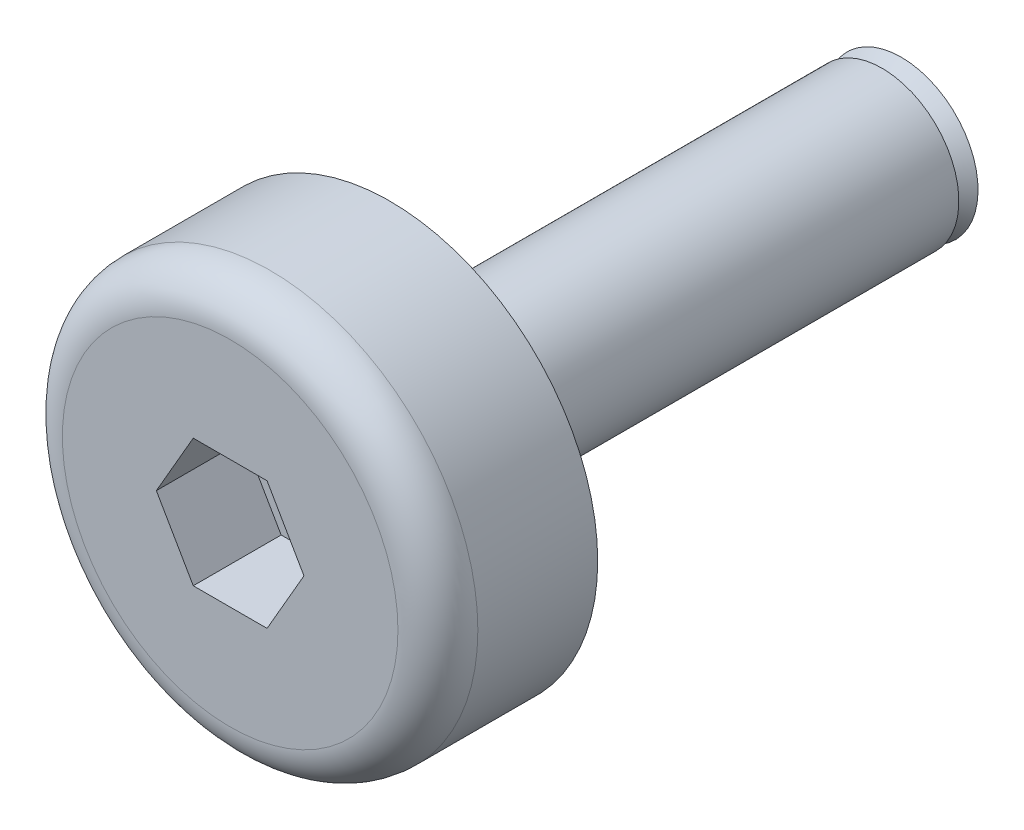
ISO-10303-21;
HEADER;
FILE_DESCRIPTION(('STEP AP214'),'2;1');
FILE_NAME('part.step','',(''),(''),'','','');
FILE_SCHEMA(('AUTOMOTIVE_DESIGN { 1 0 10303 214 1 1 1 1 }'));
ENDSEC;
DATA;
#1=APPLICATION_CONTEXT('core data for automotive mechanical design processes');
#2=APPLICATION_PROTOCOL_DEFINITION('international standard','automotive_design',2000,#1);
#3=PRODUCT_CONTEXT('',#1,'mechanical');
#4=PRODUCT('Part','Part','',(#3));
#5=PRODUCT_RELATED_PRODUCT_CATEGORY('part','',(#4));
#6=PRODUCT_DEFINITION_FORMATION('','',#4);
#7=PRODUCT_DEFINITION_CONTEXT('part definition',#1,'design');
#8=PRODUCT_DEFINITION('design','',#6,#7);
#9=PRODUCT_DEFINITION_SHAPE('','',#8);
#10=(LENGTH_UNIT() NAMED_UNIT(*) SI_UNIT(.MILLI.,.METRE.));
#11=(NAMED_UNIT(*) PLANE_ANGLE_UNIT() SI_UNIT($,.RADIAN.));
#12=(NAMED_UNIT(*) SI_UNIT($,.STERADIAN.) SOLID_ANGLE_UNIT());
#13=UNCERTAINTY_MEASURE_WITH_UNIT(LENGTH_MEASURE(1.E-05),#10,'distance_accuracy_value','');
#14=(GEOMETRIC_REPRESENTATION_CONTEXT(3) GLOBAL_UNCERTAINTY_ASSIGNED_CONTEXT((#13)) GLOBAL_UNIT_ASSIGNED_CONTEXT((#10,
#11,#12)) REPRESENTATION_CONTEXT('',''));
#15=CARTESIAN_POINT('',(0.,0.,0.));
#16=DIRECTION('',(0.,0.,1.));
#17=DIRECTION('',(1.,0.,0.));
#18=AXIS2_PLACEMENT_3D('',#15,#16,#17);
#19=CARTESIAN_POINT('',(0.,0.,2.5));
#20=DIRECTION('',(0.,0.,1.));
#21=DIRECTION('',(1.,0.,0.));
#22=AXIS2_PLACEMENT_3D('',#19,#20,#21);
#23=PLANE('',#22);
#24=CARTESIAN_POINT('',(0.,0.,2.5));
#25=DIRECTION('',(0.,0.,1.));
#26=DIRECTION('',(1.,0.,0.));
#27=AXIS2_PLACEMENT_3D('',#24,#25,#26);
#28=CIRCLE('',#27,2.625);
#29=CARTESIAN_POINT('',(2.625,0.,2.5));
#30=VERTEX_POINT('',#29);
#31=EDGE_CURVE('E142',#30,#30,#28,.T.);
#32=ORIENTED_EDGE('',*,*,#31,.T.);
#33=EDGE_LOOP('',(#32));
#34=FACE_BOUND('',#33,.T.);
#35=DIRECTION('',(0.5,-0.866025403784439,0.));
#36=VECTOR('',#35,1.);
#37=CARTESIAN_POINT('',(0.866025403784439,0.5,2.5));
#38=LINE('',#37,#36);
#39=CARTESIAN_POINT('',(0.577350269189626,1.,2.5));
#40=VERTEX_POINT('',#39);
#41=CARTESIAN_POINT('',(1.15470053837925,0.,2.5));
#42=VERTEX_POINT('',#41);
#43=EDGE_CURVE('E51',#40,#42,#38,.T.);
#44=ORIENTED_EDGE('',*,*,#43,.T.);
#45=DIRECTION('',(-0.5,-0.866025403784439,0.));
#46=VECTOR('',#45,1.);
#47=CARTESIAN_POINT('',(0.866025403784439,-0.5,2.5));
#48=LINE('',#47,#46);
#49=CARTESIAN_POINT('',(0.577350269189626,-1.,2.5));
#50=VERTEX_POINT('',#49);
#51=EDGE_CURVE('E11',#42,#50,#48,.T.);
#52=ORIENTED_EDGE('',*,*,#51,.T.);
#53=DIRECTION('',(-1.,0.,0.));
#54=VECTOR('',#53,1.);
#55=CARTESIAN_POINT('',(0.,-1.,2.5));
#56=LINE('',#55,#54);
#57=CARTESIAN_POINT('',(-0.577350269189626,-1.,2.5));
#58=VERTEX_POINT('',#57);
#59=EDGE_CURVE('E148',#50,#58,#56,.T.);
#60=ORIENTED_EDGE('',*,*,#59,.T.);
#61=DIRECTION('',(-0.5,0.866025403784439,0.));
#62=VECTOR('',#61,1.);
#63=CARTESIAN_POINT('',(-0.866025403784439,-0.5,2.5));
#64=LINE('',#63,#62);
#65=CARTESIAN_POINT('',(-1.15470053837925,0.,2.5));
#66=VERTEX_POINT('',#65);
#67=EDGE_CURVE('E151',#58,#66,#64,.T.);
#68=ORIENTED_EDGE('',*,*,#67,.T.);
#69=DIRECTION('',(0.5,0.866025403784439,0.));
#70=VECTOR('',#69,1.);
#71=CARTESIAN_POINT('',(-0.866025403784438,0.5,2.5));
#72=LINE('',#71,#70);
#73=CARTESIAN_POINT('',(-0.577350269189625,0.999999999999999,2.5));
#74=VERTEX_POINT('',#73);
#75=EDGE_CURVE('E154',#66,#74,#72,.T.);
#76=ORIENTED_EDGE('',*,*,#75,.T.);
#77=DIRECTION('',(1.,0.,0.));
#78=VECTOR('',#77,1.);
#79=CARTESIAN_POINT('',(0.,1.,2.5));
#80=LINE('',#79,#78);
#81=EDGE_CURVE('E157',#74,#40,#80,.T.);
#82=ORIENTED_EDGE('',*,*,#81,.T.);
#83=EDGE_LOOP('',(#44,#52,#60,#68,#76,#82));
#84=FACE_BOUND('',#83,.T.);
#85=ADVANCED_FACE('F43',(#34,#84),#23,.T.);
#86=CARTESIAN_POINT('',(0.,0.,2.5));
#87=DIRECTION('',(0.,0.,-1.));
#88=DIRECTION('',(-1.,0.,0.));
#89=AXIS2_PLACEMENT_3D('',#86,#87,#88);
#90=CYLINDRICAL_SURFACE('',#89,3.25);
#91=CARTESIAN_POINT('',(0.,0.,1.875));
#92=DIRECTION('',(0.,0.,1.));
#93=DIRECTION('',(1.,0.,0.));
#94=AXIS2_PLACEMENT_3D('',#91,#92,#93);
#95=CIRCLE('',#94,3.25);
#96=CARTESIAN_POINT('',(3.25,0.,1.875));
#97=VERTEX_POINT('',#96);
#98=EDGE_CURVE('E145',#97,#97,#95,.F.);
#99=ORIENTED_EDGE('',*,*,#98,.T.);
#100=EDGE_LOOP('',(#99));
#101=FACE_BOUND('',#100,.T.);
#102=CARTESIAN_POINT('',(0.,0.,0.));
#103=DIRECTION('',(0.,0.,1.));
#104=DIRECTION('',(1.,0.,0.));
#105=AXIS2_PLACEMENT_3D('',#102,#103,#104);
#106=CIRCLE('',#105,3.25);
#107=CARTESIAN_POINT('',(3.25,0.,0.));
#108=VERTEX_POINT('',#107);
#109=EDGE_CURVE('E100',#108,#108,#106,.T.);
#110=ORIENTED_EDGE('',*,*,#109,.T.);
#111=EDGE_LOOP('',(#110));
#112=FACE_BOUND('',#111,.T.);
#113=ADVANCED_FACE('F181',(#101,#112),#90,.T.);
#114=CARTESIAN_POINT('',(0.,0.,0.));
#115=DIRECTION('',(0.,0.,1.));
#116=DIRECTION('',(1.,0.,0.));
#117=AXIS2_PLACEMENT_3D('',#114,#115,#116);
#118=PLANE('',#117);
#119=CARTESIAN_POINT('',(0.,0.,0.));
#120=DIRECTION('',(0.,0.,1.));
#121=DIRECTION('',(1.,0.,0.));
#122=AXIS2_PLACEMENT_3D('',#119,#120,#121);
#123=CIRCLE('',#122,1.2);
#124=CARTESIAN_POINT('',(-1.2,0.,0.));
#125=VERTEX_POINT('',#124);
#126=EDGE_CURVE('E119',#125,#125,#123,.T.);
#127=ORIENTED_EDGE('',*,*,#126,.T.);
#128=EDGE_LOOP('',(#127));
#129=FACE_BOUND('',#128,.T.);
#130=ORIENTED_EDGE('',*,*,#109,.F.);
#131=EDGE_LOOP('',(#130));
#132=FACE_BOUND('',#131,.T.);
#133=ADVANCED_FACE('F187',(#129,#132),#118,.F.);
#134=CARTESIAN_POINT('',(0.,0.,1.875));
#135=DIRECTION('',(0.,0.,1.));
#136=DIRECTION('',(1.,0.,0.));
#137=AXIS2_PLACEMENT_3D('',#134,#135,#136);
#138=TOROIDAL_SURFACE('',#137,2.625,0.625);
#139=ORIENTED_EDGE('',*,*,#98,.F.);
#140=EDGE_LOOP('',(#139));
#141=FACE_BOUND('',#140,.T.);
#142=ORIENTED_EDGE('',*,*,#31,.F.);
#143=EDGE_LOOP('',(#142));
#144=FACE_BOUND('',#143,.T.);
#145=ADVANCED_FACE('F45',(#141,#144),#138,.T.);
#146=CARTESIAN_POINT('',(0.577350269189626,-1.,2.51));
#147=DIRECTION('',(-0.866025403784439,0.5,0.));
#148=DIRECTION('',(-0.5,-0.866025403784439,0.));
#149=AXIS2_PLACEMENT_3D('',#146,#147,#148);
#150=PLANE('',#149);
#151=DIRECTION('',(0.,0.,-1.));
#152=VECTOR('',#151,1.);
#153=CARTESIAN_POINT('',(1.15470053837925,0.,2.51));
#154=LINE('',#153,#152);
#155=CARTESIAN_POINT('',(1.15470053837925,0.,1.125));
#156=VERTEX_POINT('',#155);
#157=EDGE_CURVE('E93',#42,#156,#154,.T.);
#158=ORIENTED_EDGE('',*,*,#157,.T.);
#159=DIRECTION('',(0.5,0.866025403784439,0.));
#160=VECTOR('',#159,1.);
#161=CARTESIAN_POINT('',(0.577350269189626,-1.,1.125));
#162=LINE('',#161,#160);
#163=CARTESIAN_POINT('',(0.577350269189626,-1.,1.125));
#164=VERTEX_POINT('',#163);
#165=EDGE_CURVE('E97',#164,#156,#162,.T.);
#166=ORIENTED_EDGE('',*,*,#165,.F.);
#167=DIRECTION('',(0.,0.,-1.));
#168=VECTOR('',#167,1.);
#169=CARTESIAN_POINT('',(0.577350269189626,-1.,2.51));
#170=LINE('',#169,#168);
#171=EDGE_CURVE('E132',#50,#164,#170,.T.);
#172=ORIENTED_EDGE('',*,*,#171,.F.);
#173=ORIENTED_EDGE('',*,*,#51,.F.);
#174=EDGE_LOOP('',(#158,#166,#172,#173));
#175=FACE_BOUND('',#174,.T.);
#176=ADVANCED_FACE('F95',(#175),#150,.T.);
#177=CARTESIAN_POINT('',(1.15470053837925,0.,2.51));
#178=DIRECTION('',(-0.866025403784439,-0.5,0.));
#179=DIRECTION('',(0.,0.,1.));
#180=AXIS2_PLACEMENT_3D('',#177,#178,#179);
#181=PLANE('',#180);
#182=DIRECTION('',(0.,0.,-1.));
#183=VECTOR('',#182,1.);
#184=CARTESIAN_POINT('',(0.577350269189626,1.,2.51));
#185=LINE('',#184,#183);
#186=CARTESIAN_POINT('',(0.577350269189626,1.,1.125));
#187=VERTEX_POINT('',#186);
#188=EDGE_CURVE('E101',#40,#187,#185,.T.);
#189=ORIENTED_EDGE('',*,*,#188,.T.);
#190=DIRECTION('',(-0.5,0.866025403784439,0.));
#191=VECTOR('',#190,1.);
#192=CARTESIAN_POINT('',(1.15470053837925,0.,1.125));
#193=LINE('',#192,#191);
#194=EDGE_CURVE('E104',#156,#187,#193,.T.);
#195=ORIENTED_EDGE('',*,*,#194,.F.);
#196=ORIENTED_EDGE('',*,*,#157,.F.);
#197=ORIENTED_EDGE('',*,*,#43,.F.);
#198=EDGE_LOOP('',(#189,#195,#196,#197));
#199=FACE_BOUND('',#198,.T.);
#200=ADVANCED_FACE('F105',(#199),#181,.T.);
#201=CARTESIAN_POINT('',(0.577350269189626,1.,2.51));
#202=DIRECTION('',(0.,-1.,0.));
#203=DIRECTION('',(1.,0.,0.));
#204=AXIS2_PLACEMENT_3D('',#201,#202,#203);
#205=PLANE('',#204);
#206=DIRECTION('',(0.,0.,-1.));
#207=VECTOR('',#206,1.);
#208=CARTESIAN_POINT('',(-0.577350269189625,0.999999999999999,2.51));
#209=LINE('',#208,#207);
#210=CARTESIAN_POINT('',(-0.577350269189625,0.999999999999999,1.125));
#211=VERTEX_POINT('',#210);
#212=EDGE_CURVE('E137',#74,#211,#209,.T.);
#213=ORIENTED_EDGE('',*,*,#212,.T.);
#214=DIRECTION('',(-1.,0.,0.));
#215=VECTOR('',#214,1.);
#216=CARTESIAN_POINT('',(0.577350269189626,1.,1.125));
#217=LINE('',#216,#215);
#218=EDGE_CURVE('E110',#187,#211,#217,.T.);
#219=ORIENTED_EDGE('',*,*,#218,.F.);
#220=ORIENTED_EDGE('',*,*,#188,.F.);
#221=ORIENTED_EDGE('',*,*,#81,.F.);
#222=EDGE_LOOP('',(#213,#219,#220,#221));
#223=FACE_BOUND('',#222,.T.);
#224=ADVANCED_FACE('F161',(#223),#205,.T.);
#225=CARTESIAN_POINT('',(-0.577350269189625,0.999999999999999,2.51));
#226=DIRECTION('',(0.866025403784439,-0.5,0.));
#227=DIRECTION('',(0.5,0.866025403784439,0.));
#228=AXIS2_PLACEMENT_3D('',#225,#226,#227);
#229=PLANE('',#228);
#230=DIRECTION('',(0.,0.,-1.));
#231=VECTOR('',#230,1.);
#232=CARTESIAN_POINT('',(-1.15470053837925,0.,2.51));
#233=LINE('',#232,#231);
#234=CARTESIAN_POINT('',(-1.15470053837925,0.,1.125));
#235=VERTEX_POINT('',#234);
#236=EDGE_CURVE('E135',#66,#235,#233,.T.);
#237=ORIENTED_EDGE('',*,*,#236,.T.);
#238=DIRECTION('',(-0.5,-0.866025403784439,0.));
#239=VECTOR('',#238,1.);
#240=CARTESIAN_POINT('',(-0.577350269189625,0.999999999999999,1.125));
#241=LINE('',#240,#239);
#242=EDGE_CURVE('E126',#211,#235,#241,.T.);
#243=ORIENTED_EDGE('',*,*,#242,.F.);
#244=ORIENTED_EDGE('',*,*,#212,.F.);
#245=ORIENTED_EDGE('',*,*,#75,.F.);
#246=EDGE_LOOP('',(#237,#243,#244,#245));
#247=FACE_BOUND('',#246,.T.);
#248=ADVANCED_FACE('F166',(#247),#229,.T.);
#249=CARTESIAN_POINT('',(-1.15470053837925,0.,2.51));
#250=DIRECTION('',(0.866025403784439,0.5,0.));
#251=DIRECTION('',(-0.5,0.866025403784439,0.));
#252=AXIS2_PLACEMENT_3D('',#249,#250,#251);
#253=PLANE('',#252);
#254=DIRECTION('',(0.,0.,-1.));
#255=VECTOR('',#254,1.);
#256=CARTESIAN_POINT('',(-0.577350269189626,-1.,2.51));
#257=LINE('',#256,#255);
#258=CARTESIAN_POINT('',(-0.577350269189626,-1.,1.125));
#259=VERTEX_POINT('',#258);
#260=EDGE_CURVE('E58',#58,#259,#257,.T.);
#261=ORIENTED_EDGE('',*,*,#260,.T.);
#262=DIRECTION('',(0.5,-0.866025403784439,0.));
#263=VECTOR('',#262,1.);
#264=CARTESIAN_POINT('',(-1.15470053837925,0.,1.125));
#265=LINE('',#264,#263);
#266=EDGE_CURVE('E129',#235,#259,#265,.T.);
#267=ORIENTED_EDGE('',*,*,#266,.F.);
#268=ORIENTED_EDGE('',*,*,#236,.F.);
#269=ORIENTED_EDGE('',*,*,#67,.F.);
#270=EDGE_LOOP('',(#261,#267,#268,#269));
#271=FACE_BOUND('',#270,.T.);
#272=ADVANCED_FACE('F169',(#271),#253,.T.);
#273=CARTESIAN_POINT('',(-0.577350269189626,-1.,2.51));
#274=DIRECTION('',(0.,1.,0.));
#275=DIRECTION('',(-1.,0.,0.));
#276=AXIS2_PLACEMENT_3D('',#273,#274,#275);
#277=PLANE('',#276);
#278=ORIENTED_EDGE('',*,*,#171,.T.);
#279=DIRECTION('',(1.,0.,0.));
#280=VECTOR('',#279,1.);
#281=CARTESIAN_POINT('',(-0.577350269189626,-1.,1.125));
#282=LINE('',#281,#280);
#283=EDGE_CURVE('E115',#259,#164,#282,.T.);
#284=ORIENTED_EDGE('',*,*,#283,.F.);
#285=ORIENTED_EDGE('',*,*,#260,.F.);
#286=ORIENTED_EDGE('',*,*,#59,.F.);
#287=EDGE_LOOP('',(#278,#284,#285,#286));
#288=FACE_BOUND('',#287,.T.);
#289=ADVANCED_FACE('F170',(#288),#277,.T.);
#290=CARTESIAN_POINT('',(1.15470053837925,0.,1.125));
#291=DIRECTION('',(0.,0.,1.));
#292=DIRECTION('',(-0.5,0.866025403784439,0.));
#293=AXIS2_PLACEMENT_3D('',#290,#291,#292);
#294=PLANE('',#293);
#295=ORIENTED_EDGE('',*,*,#165,.T.);
#296=ORIENTED_EDGE('',*,*,#194,.T.);
#297=ORIENTED_EDGE('',*,*,#218,.T.);
#298=ORIENTED_EDGE('',*,*,#242,.T.);
#299=ORIENTED_EDGE('',*,*,#266,.T.);
#300=ORIENTED_EDGE('',*,*,#283,.T.);
#301=EDGE_LOOP('',(#295,#296,#297,#298,#299,#300));
#302=FACE_BOUND('',#301,.T.);
#303=ADVANCED_FACE('F113',(#302),#294,.T.);
#304=CARTESIAN_POINT('',(0.,0.,0.));
#305=DIRECTION('',(0.,0.,-1.));
#306=DIRECTION('',(-1.,0.,0.));
#307=AXIS2_PLACEMENT_3D('',#304,#305,#306);
#308=CYLINDRICAL_SURFACE('',#307,1.2);
#309=CARTESIAN_POINT('',(0.,0.,-7.7));
#310=DIRECTION('',(0.,0.,1.));
#311=DIRECTION('',(1.,0.,0.));
#312=AXIS2_PLACEMENT_3D('',#309,#310,#311);
#313=CIRCLE('',#312,1.2);
#314=CARTESIAN_POINT('',(-1.2,0.,-7.7));
#315=VERTEX_POINT('',#314);
#316=EDGE_CURVE('E122',#315,#315,#313,.T.);
#317=CARTESIAN_POINT('',(-1.2,0.,0.));
#318=CARTESIAN_POINT('',(-1.2,0.,-0.0802083333333335));
#319=CARTESIAN_POINT('',(-1.2,0.,-0.160416666666667));
#320=CARTESIAN_POINT('',(-1.2,0.,-0.320833333333333));
#321=CARTESIAN_POINT('',(-1.2,0.,-0.401041666666667));
#322=CARTESIAN_POINT('',(-1.2,0.,-0.561458333333333));
#323=CARTESIAN_POINT('',(-1.2,0.,-0.641666666666667));
#324=CARTESIAN_POINT('',(-1.2,0.,-0.802083333333333));
#325=CARTESIAN_POINT('',(-1.2,0.,-0.882291666666667));
#326=CARTESIAN_POINT('',(-1.2,0.,-1.04270833333333));
#327=CARTESIAN_POINT('',(-1.2,0.,-1.12291666666667));
#328=CARTESIAN_POINT('',(-1.2,0.,-1.28333333333333));
#329=CARTESIAN_POINT('',(-1.2,0.,-1.36354166666667));
#330=CARTESIAN_POINT('',(-1.2,0.,-1.52395833333333));
#331=CARTESIAN_POINT('',(-1.2,0.,-1.60416666666667));
#332=CARTESIAN_POINT('',(-1.2,0.,-1.76458333333333));
#333=CARTESIAN_POINT('',(-1.2,0.,-1.84479166666667));
#334=CARTESIAN_POINT('',(-1.2,0.,-2.00520833333333));
#335=CARTESIAN_POINT('',(-1.2,0.,-2.08541666666667));
#336=CARTESIAN_POINT('',(-1.2,0.,-2.24583333333333));
#337=CARTESIAN_POINT('',(-1.2,0.,-2.32604166666667));
#338=CARTESIAN_POINT('',(-1.2,0.,-2.48645833333333));
#339=CARTESIAN_POINT('',(-1.2,0.,-2.56666666666667));
#340=CARTESIAN_POINT('',(-1.2,0.,-2.72708333333333));
#341=CARTESIAN_POINT('',(-1.2,0.,-2.80729166666667));
#342=CARTESIAN_POINT('',(-1.2,0.,-2.96770833333333));
#343=CARTESIAN_POINT('',(-1.2,0.,-3.04791666666667));
#344=CARTESIAN_POINT('',(-1.2,0.,-3.20833333333333));
#345=CARTESIAN_POINT('',(-1.2,0.,-3.28854166666667));
#346=CARTESIAN_POINT('',(-1.2,0.,-3.44895833333333));
#347=CARTESIAN_POINT('',(-1.2,0.,-3.52916666666667));
#348=CARTESIAN_POINT('',(-1.2,0.,-3.68958333333333));
#349=CARTESIAN_POINT('',(-1.2,0.,-3.76979166666667));
#350=CARTESIAN_POINT('',(-1.2,0.,-3.93020833333333));
#351=CARTESIAN_POINT('',(-1.2,0.,-4.01041666666667));
#352=CARTESIAN_POINT('',(-1.2,0.,-4.17083333333333));
#353=CARTESIAN_POINT('',(-1.2,0.,-4.25104166666667));
#354=CARTESIAN_POINT('',(-1.2,0.,-4.41145833333333));
#355=CARTESIAN_POINT('',(-1.2,0.,-4.49166666666667));
#356=CARTESIAN_POINT('',(-1.2,0.,-4.65208333333333));
#357=CARTESIAN_POINT('',(-1.2,0.,-4.73229166666667));
#358=CARTESIAN_POINT('',(-1.2,0.,-4.89270833333333));
#359=CARTESIAN_POINT('',(-1.2,0.,-4.97291666666667));
#360=CARTESIAN_POINT('',(-1.2,0.,-5.13333333333333));
#361=CARTESIAN_POINT('',(-1.2,0.,-5.21354166666667));
#362=CARTESIAN_POINT('',(-1.2,0.,-5.37395833333333));
#363=CARTESIAN_POINT('',(-1.2,0.,-5.45416666666667));
#364=CARTESIAN_POINT('',(-1.2,0.,-5.61458333333333));
#365=CARTESIAN_POINT('',(-1.2,0.,-5.69479166666667));
#366=CARTESIAN_POINT('',(-1.2,0.,-5.85520833333333));
#367=CARTESIAN_POINT('',(-1.2,0.,-5.93541666666667));
#368=CARTESIAN_POINT('',(-1.2,0.,-6.09583333333333));
#369=CARTESIAN_POINT('',(-1.2,0.,-6.17604166666667));
#370=CARTESIAN_POINT('',(-1.2,0.,-6.33645833333333));
#371=CARTESIAN_POINT('',(-1.2,0.,-6.41666666666667));
#372=CARTESIAN_POINT('',(-1.2,0.,-6.57708333333333));
#373=CARTESIAN_POINT('',(-1.2,0.,-6.65729166666667));
#374=CARTESIAN_POINT('',(-1.2,0.,-6.81770833333333));
#375=CARTESIAN_POINT('',(-1.2,0.,-6.89791666666667));
#376=CARTESIAN_POINT('',(-1.2,0.,-7.05833333333333));
#377=CARTESIAN_POINT('',(-1.2,0.,-7.13854166666667));
#378=CARTESIAN_POINT('',(-1.2,0.,-7.29895833333333));
#379=CARTESIAN_POINT('',(-1.2,0.,-7.37916666666667));
#380=CARTESIAN_POINT('',(-1.2,0.,-7.53958333333333));
#381=CARTESIAN_POINT('',(-1.2,0.,-7.61979166666667));
#382=CARTESIAN_POINT('',(-1.2,0.,-7.7));
#383=B_SPLINE_CURVE_WITH_KNOTS('',3,(#317,#318,#319,#320,#321,#322,#323,#324,#325,#326,#327,
#328,#329,#330,#331,#332,#333,#334,#335,#336,#337,#338,#339,#340,#341,#342,#343,#344,#345,#346,
#347,#348,#349,#350,#351,#352,#353,#354,#355,#356,#357,#358,#359,#360,#361,#362,#363,#364,#365,
#366,#367,#368,#369,#370,#371,#372,#373,#374,#375,#376,#377,#378,#379,#380,#381,#382),
.UNSPECIFIED.,.F.,.F.,(4,2,2,2,2,2,2,2,2,2,2,2,2,2,2,2,2,2,2,2,2,2,2,2,2,2,2,2,2,2,2,2,4),(0.,
0.240625,0.48125,0.721875,0.9625,1.203125,1.44375,1.684375,1.925,2.165625,2.40625,2.646875,
2.8875,3.128125,3.36875,3.609375,3.85,4.090625,4.33125,4.571875,4.8125,5.053125,5.29375,
5.534375,5.775,6.015625,6.25625,6.496875,6.7375,6.978125,7.21875,7.459375,7.7),.UNSPECIFIED.);
#384=EDGE_CURVE('BSEAM177',#125,#315,#383,.T.);
#385=ORIENTED_EDGE('',*,*,#126,.F.);
#386=ORIENTED_EDGE('',*,*,#316,.T.);
#387=ORIENTED_EDGE('',*,*,#384,.T.);
#388=ORIENTED_EDGE('',*,*,#384,.F.);
#389=EDGE_LOOP('',(#385,#387,#386,#388));
#390=FACE_BOUND('',#389,.T.);
#391=ADVANCED_FACE('F177',(#390),#308,.T.);
#392=CARTESIAN_POINT('',(0.,0.,-7.7));
#393=DIRECTION('',(0.,0.,1.));
#394=DIRECTION('',(1.,0.,0.));
#395=AXIS2_PLACEMENT_3D('',#392,#393,#394);
#396=PLANE('',#395);
#397=CARTESIAN_POINT('',(0.,0.,-7.70000000000001));
#398=DIRECTION('',(0.,0.,-1.));
#399=DIRECTION('',(0.,1.,0.));
#400=AXIS2_PLACEMENT_3D('',#397,#398,#399);
#401=CIRCLE('',#400,0.9);
#402=CARTESIAN_POINT('',(0.,0.9,-7.70000000000001));
#403=VERTEX_POINT('',#402);
#404=EDGE_CURVE('E116',#403,#403,#401,.T.);
#405=ORIENTED_EDGE('',*,*,#404,.F.);
#406=EDGE_LOOP('',(#405));
#407=FACE_BOUND('',#406,.T.);
#408=ORIENTED_EDGE('',*,*,#316,.F.);
#409=EDGE_LOOP('',(#408));
#410=FACE_BOUND('',#409,.T.);
#411=ADVANCED_FACE('F219',(#407,#410),#396,.F.);
#412=CARTESIAN_POINT('',(0.,0.,-8.));
#413=DIRECTION('',(0.,0.,-1.));
#414=DIRECTION('',(0.,1.,0.));
#415=AXIS2_PLACEMENT_3D('',#412,#413,#414);
#416=PLANE('',#415);
#417=CARTESIAN_POINT('',(0.,0.,-8.));
#418=DIRECTION('',(0.,0.,-1.));
#419=DIRECTION('',(0.,1.,0.));
#420=AXIS2_PLACEMENT_3D('',#417,#418,#419);
#421=CIRCLE('',#420,1.2);
#422=CARTESIAN_POINT('',(0.,1.2,-8.));
#423=VERTEX_POINT('',#422);
#424=EDGE_CURVE('E205',#423,#423,#421,.T.);
#425=ORIENTED_EDGE('',*,*,#424,.T.);
#426=EDGE_LOOP('',(#425));
#427=FACE_BOUND('',#426,.T.);
#428=ADVANCED_FACE('F210',(#427),#416,.T.);
#429=CARTESIAN_POINT('',(0.,0.,-8.));
#430=DIRECTION('',(0.,0.,-1.));
#431=DIRECTION('',(0.,1.,0.));
#432=AXIS2_PLACEMENT_3D('',#429,#430,#431);
#433=CONICAL_SURFACE('',#432,1.2,0.785398163397457);
#434=ORIENTED_EDGE('',*,*,#404,.T.);
#435=EDGE_LOOP('',(#434));
#436=FACE_BOUND('',#435,.T.);
#437=ORIENTED_EDGE('',*,*,#424,.F.);
#438=EDGE_LOOP('',(#437));
#439=FACE_BOUND('',#438,.T.);
#440=ADVANCED_FACE('F212',(#436,#439),#433,.T.);
#441=CLOSED_SHELL('',(#85,#113,#133,#145,#176,#200,#224,#248,#272,#289,#303,#391,#411,#428,#440));
#442=MANIFOLD_SOLID_BREP('B2',#441);
#443=ADVANCED_BREP_SHAPE_REPRESENTATION('',(#18,#442),#14);
#444=SHAPE_DEFINITION_REPRESENTATION(#9,#443);
ENDSEC;
END-ISO-10303-21;
